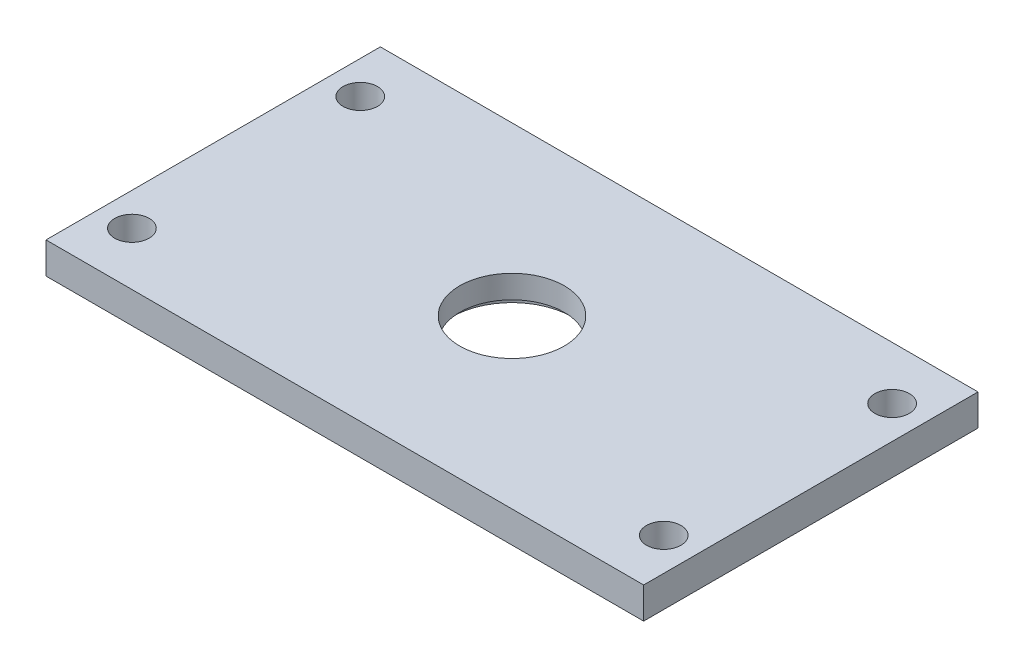
ISO-10303-21;
HEADER;
FILE_DESCRIPTION(('STEP AP214'),'2;1');
FILE_NAME('part.step','',(''),(''),'','','');
FILE_SCHEMA(('AUTOMOTIVE_DESIGN { 1 0 10303 214 1 1 1 1 }'));
ENDSEC;
DATA;
#1=APPLICATION_CONTEXT('core data for automotive mechanical design processes');
#2=APPLICATION_PROTOCOL_DEFINITION('international standard','automotive_design',2000,#1);
#3=PRODUCT_CONTEXT('',#1,'mechanical');
#4=PRODUCT('Part','Part','',(#3));
#5=PRODUCT_RELATED_PRODUCT_CATEGORY('part','',(#4));
#6=PRODUCT_DEFINITION_FORMATION('','',#4);
#7=PRODUCT_DEFINITION_CONTEXT('part definition',#1,'design');
#8=PRODUCT_DEFINITION('design','',#6,#7);
#9=PRODUCT_DEFINITION_SHAPE('','',#8);
#10=(LENGTH_UNIT() NAMED_UNIT(*) SI_UNIT(.MILLI.,.METRE.));
#11=(NAMED_UNIT(*) PLANE_ANGLE_UNIT() SI_UNIT($,.RADIAN.));
#12=(NAMED_UNIT(*) SI_UNIT($,.STERADIAN.) SOLID_ANGLE_UNIT());
#13=UNCERTAINTY_MEASURE_WITH_UNIT(LENGTH_MEASURE(1.E-05),#10,'distance_accuracy_value','');
#14=(GEOMETRIC_REPRESENTATION_CONTEXT(3) GLOBAL_UNCERTAINTY_ASSIGNED_CONTEXT((#13)) GLOBAL_UNIT_ASSIGNED_CONTEXT((#10,
#11,#12)) REPRESENTATION_CONTEXT('',''));
#15=CARTESIAN_POINT('',(0.,0.,0.));
#16=DIRECTION('',(0.,0.,1.));
#17=DIRECTION('',(1.,0.,0.));
#18=AXIS2_PLACEMENT_3D('',#15,#16,#17);
#19=CARTESIAN_POINT('',(0.,8.801,0.));
#20=DIRECTION('',(0.,-1.,0.));
#21=DIRECTION('',(0.,0.,-1.));
#22=AXIS2_PLACEMENT_3D('',#19,#20,#21);
#23=CYLINDRICAL_SURFACE('',#22,5.);
#24=CARTESIAN_POINT('',(0.,-17.2,0.));
#25=DIRECTION('',(0.,1.,0.));
#26=DIRECTION('',(0.,0.,1.));
#27=AXIS2_PLACEMENT_3D('',#24,#25,#26);
#28=CIRCLE('',#27,5.);
#29=CARTESIAN_POINT('',(0.,-17.2,5.));
#30=VERTEX_POINT('',#29);
#31=EDGE_CURVE('E271',#30,#30,#28,.F.);
#32=ORIENTED_EDGE('',*,*,#31,.F.);
#33=EDGE_LOOP('',(#32));
#34=FACE_BOUND('',#33,.T.);
#35=CARTESIAN_POINT('',(0.,-19.4,0.));
#36=DIRECTION('',(0.,-1.,0.));
#37=DIRECTION('',(0.,0.,-1.));
#38=AXIS2_PLACEMENT_3D('',#35,#36,#37);
#39=CIRCLE('',#38,5.);
#40=CARTESIAN_POINT('',(0.,-19.4,-5.));
#41=VERTEX_POINT('',#40);
#42=EDGE_CURVE('E267',#41,#41,#39,.T.);
#43=ORIENTED_EDGE('',*,*,#42,.T.);
#44=EDGE_LOOP('',(#43));
#45=FACE_BOUND('',#44,.T.);
#46=ADVANCED_FACE('F39',(#34,#45),#23,.F.);
#47=CARTESIAN_POINT('',(0.,-20.2,0.));
#48=DIRECTION('',(0.,1.,0.));
#49=DIRECTION('',(0.,0.,1.));
#50=AXIS2_PLACEMENT_3D('',#47,#48,#49);
#51=PLANE('',#50);
#52=CARTESIAN_POINT('',(0.,-20.2,0.));
#53=DIRECTION('',(0.,-1.,0.));
#54=DIRECTION('',(0.,0.,-1.));
#55=AXIS2_PLACEMENT_3D('',#52,#53,#54);
#56=CIRCLE('',#55,5.8);
#57=CARTESIAN_POINT('',(0.,-20.2,-5.8));
#58=VERTEX_POINT('',#57);
#59=EDGE_CURVE('E272',#58,#58,#56,.T.);
#60=ORIENTED_EDGE('',*,*,#59,.F.);
#61=EDGE_LOOP('',(#60));
#62=FACE_BOUND('',#61,.T.);
#63=CARTESIAN_POINT('',(-25.45,-20.2,-10.9277472107018));
#64=DIRECTION('',(0.,1.,0.));
#65=DIRECTION('',(0.,0.,1.));
#66=AXIS2_PLACEMENT_3D('',#63,#64,#65);
#67=CIRCLE('',#66,1.65);
#68=CARTESIAN_POINT('',(-25.45,-20.2,-9.27774721070175));
#69=VERTEX_POINT('',#68);
#70=EDGE_CURVE('E281',#69,#69,#67,.T.);
#71=ORIENTED_EDGE('',*,*,#70,.T.);
#72=EDGE_LOOP('',(#71));
#73=FACE_BOUND('',#72,.T.);
#74=CARTESIAN_POINT('',(25.45,-20.2,-10.9277472107018));
#75=DIRECTION('',(0.,1.,0.));
#76=DIRECTION('',(0.,0.,1.));
#77=AXIS2_PLACEMENT_3D('',#74,#75,#76);
#78=CIRCLE('',#77,1.65);
#79=CARTESIAN_POINT('',(25.45,-20.2,-9.27774721070175));
#80=VERTEX_POINT('',#79);
#81=EDGE_CURVE('E111',#80,#80,#78,.T.);
#82=ORIENTED_EDGE('',*,*,#81,.T.);
#83=EDGE_LOOP('',(#82));
#84=FACE_BOUND('',#83,.T.);
#85=DIRECTION('',(0.,0.,1.));
#86=VECTOR('',#85,1.);
#87=CARTESIAN_POINT('',(-28.6,-20.2,-16.));
#88=LINE('',#87,#86);
#89=CARTESIAN_POINT('',(-28.6,-20.2,-16.));
#90=VERTEX_POINT('',#89);
#91=CARTESIAN_POINT('',(-28.6,-20.2,16.));
#92=VERTEX_POINT('',#91);
#93=EDGE_CURVE('E101',#90,#92,#88,.T.);
#94=ORIENTED_EDGE('',*,*,#93,.F.);
#95=DIRECTION('',(1.,0.,0.));
#96=VECTOR('',#95,1.);
#97=CARTESIAN_POINT('',(-28.6,-20.2,-16.));
#98=LINE('',#97,#96);
#99=CARTESIAN_POINT('',(28.6,-20.2,-16.));
#100=VERTEX_POINT('',#99);
#101=EDGE_CURVE('E91',#90,#100,#98,.T.);
#102=ORIENTED_EDGE('',*,*,#101,.T.);
#103=DIRECTION('',(0.,0.,1.));
#104=VECTOR('',#103,1.);
#105=CARTESIAN_POINT('',(28.6,-20.2,-16.));
#106=LINE('',#105,#104);
#107=CARTESIAN_POINT('',(28.6,-20.2,16.));
#108=VERTEX_POINT('',#107);
#109=EDGE_CURVE('E85',#100,#108,#106,.T.);
#110=ORIENTED_EDGE('',*,*,#109,.T.);
#111=DIRECTION('',(1.,0.,0.));
#112=VECTOR('',#111,1.);
#113=CARTESIAN_POINT('',(-28.6,-20.2,16.));
#114=LINE('',#113,#112);
#115=EDGE_CURVE('E90',#92,#108,#114,.T.);
#116=ORIENTED_EDGE('',*,*,#115,.F.);
#117=EDGE_LOOP('',(#94,#102,#110,#116));
#118=FACE_BOUND('',#117,.T.);
#119=CARTESIAN_POINT('',(25.45,-20.2,10.9277472107018));
#120=DIRECTION('',(0.,-1.,0.));
#121=DIRECTION('',(0.,0.,-1.));
#122=AXIS2_PLACEMENT_3D('',#119,#120,#121);
#123=CIRCLE('',#122,1.65);
#124=CARTESIAN_POINT('',(25.45,-20.2,9.27774721070175));
#125=VERTEX_POINT('',#124);
#126=EDGE_CURVE('E293',#125,#125,#123,.T.);
#127=ORIENTED_EDGE('',*,*,#126,.F.);
#128=EDGE_LOOP('',(#127));
#129=FACE_BOUND('',#128,.T.);
#130=CARTESIAN_POINT('',(-25.45,-20.2,10.9277472107018));
#131=DIRECTION('',(0.,-1.,0.));
#132=DIRECTION('',(0.,0.,-1.));
#133=AXIS2_PLACEMENT_3D('',#130,#131,#132);
#134=CIRCLE('',#133,1.65);
#135=CARTESIAN_POINT('',(-25.45,-20.2,9.27774721070175));
#136=VERTEX_POINT('',#135);
#137=EDGE_CURVE('E287',#136,#136,#134,.T.);
#138=ORIENTED_EDGE('',*,*,#137,.F.);
#139=EDGE_LOOP('',(#138));
#140=FACE_BOUND('',#139,.T.);
#141=ADVANCED_FACE('F88',(#62,#73,#84,#118,#129,#140),#51,.F.);
#142=CARTESIAN_POINT('',(0.,-17.2,0.));
#143=DIRECTION('',(0.,1.,0.));
#144=DIRECTION('',(0.,0.,1.));
#145=AXIS2_PLACEMENT_3D('',#142,#143,#144);
#146=PLANE('',#145);
#147=ORIENTED_EDGE('',*,*,#31,.T.);
#148=EDGE_LOOP('',(#147));
#149=FACE_BOUND('',#148,.T.);
#150=CARTESIAN_POINT('',(-25.45,-17.2,-10.9277472107018));
#151=DIRECTION('',(0.,1.,0.));
#152=DIRECTION('',(0.,0.,1.));
#153=AXIS2_PLACEMENT_3D('',#150,#151,#152);
#154=CIRCLE('',#153,1.65);
#155=CARTESIAN_POINT('',(-25.45,-17.2,-9.27774721070175));
#156=VERTEX_POINT('',#155);
#157=EDGE_CURVE('E275',#156,#156,#154,.T.);
#158=ORIENTED_EDGE('',*,*,#157,.F.);
#159=EDGE_LOOP('',(#158));
#160=FACE_BOUND('',#159,.T.);
#161=CARTESIAN_POINT('',(25.45,-17.2,10.9277472107018));
#162=DIRECTION('',(0.,-1.,0.));
#163=DIRECTION('',(0.,0.,-1.));
#164=AXIS2_PLACEMENT_3D('',#161,#162,#163);
#165=CIRCLE('',#164,1.65);
#166=CARTESIAN_POINT('',(25.45,-17.2,9.27774721070175));
#167=VERTEX_POINT('',#166);
#168=EDGE_CURVE('E290',#167,#167,#165,.T.);
#169=ORIENTED_EDGE('',*,*,#168,.T.);
#170=EDGE_LOOP('',(#169));
#171=FACE_BOUND('',#170,.T.);
#172=CARTESIAN_POINT('',(25.45,-17.2,-10.9277472107018));
#173=DIRECTION('',(0.,1.,0.));
#174=DIRECTION('',(0.,0.,1.));
#175=AXIS2_PLACEMENT_3D('',#172,#173,#174);
#176=CIRCLE('',#175,1.65);
#177=CARTESIAN_POINT('',(25.45,-17.2,-9.27774721070175));
#178=VERTEX_POINT('',#177);
#179=EDGE_CURVE('E296',#178,#178,#176,.T.);
#180=ORIENTED_EDGE('',*,*,#179,.F.);
#181=EDGE_LOOP('',(#180));
#182=FACE_BOUND('',#181,.T.);
#183=DIRECTION('',(0.,0.,1.));
#184=VECTOR('',#183,1.);
#185=CARTESIAN_POINT('',(-28.6,-17.2,-16.));
#186=LINE('',#185,#184);
#187=CARTESIAN_POINT('',(-28.6,-17.2,-16.));
#188=VERTEX_POINT('',#187);
#189=CARTESIAN_POINT('',(-28.6,-17.2,16.));
#190=VERTEX_POINT('',#189);
#191=EDGE_CURVE('E107',#188,#190,#186,.T.);
#192=ORIENTED_EDGE('',*,*,#191,.T.);
#193=DIRECTION('',(1.,0.,0.));
#194=VECTOR('',#193,1.);
#195=CARTESIAN_POINT('',(-28.6,-17.2,16.));
#196=LINE('',#195,#194);
#197=CARTESIAN_POINT('',(28.6,-17.2,16.));
#198=VERTEX_POINT('',#197);
#199=EDGE_CURVE('E110',#190,#198,#196,.T.);
#200=ORIENTED_EDGE('',*,*,#199,.T.);
#201=DIRECTION('',(0.,0.,1.));
#202=VECTOR('',#201,1.);
#203=CARTESIAN_POINT('',(28.6,-17.2,-16.));
#204=LINE('',#203,#202);
#205=CARTESIAN_POINT('',(28.6,-17.2,-16.));
#206=VERTEX_POINT('',#205);
#207=EDGE_CURVE('E98',#206,#198,#204,.T.);
#208=ORIENTED_EDGE('',*,*,#207,.F.);
#209=DIRECTION('',(1.,0.,0.));
#210=VECTOR('',#209,1.);
#211=CARTESIAN_POINT('',(-28.6,-17.2,-16.));
#212=LINE('',#211,#210);
#213=EDGE_CURVE('E73',#188,#206,#212,.T.);
#214=ORIENTED_EDGE('',*,*,#213,.F.);
#215=EDGE_LOOP('',(#192,#200,#208,#214));
#216=FACE_BOUND('',#215,.T.);
#217=CARTESIAN_POINT('',(-25.45,-17.2,10.9277472107018));
#218=DIRECTION('',(0.,-1.,0.));
#219=DIRECTION('',(0.,0.,-1.));
#220=AXIS2_PLACEMENT_3D('',#217,#218,#219);
#221=CIRCLE('',#220,1.65);
#222=CARTESIAN_POINT('',(-25.45,-17.2,9.27774721070175));
#223=VERTEX_POINT('',#222);
#224=EDGE_CURVE('E284',#223,#223,#221,.T.);
#225=ORIENTED_EDGE('',*,*,#224,.T.);
#226=EDGE_LOOP('',(#225));
#227=FACE_BOUND('',#226,.T.);
#228=ADVANCED_FACE('F116',(#149,#160,#171,#182,#216,#227),#146,.T.);
#229=CARTESIAN_POINT('',(-28.6,-20.2,-16.));
#230=DIRECTION('',(-1.,0.,0.));
#231=DIRECTION('',(0.,0.,1.));
#232=AXIS2_PLACEMENT_3D('',#229,#230,#231);
#233=PLANE('',#232);
#234=ORIENTED_EDGE('',*,*,#191,.F.);
#235=DIRECTION('',(0.,1.,0.));
#236=VECTOR('',#235,1.);
#237=CARTESIAN_POINT('',(-28.6,-20.2,-16.));
#238=LINE('',#237,#236);
#239=EDGE_CURVE('E11',#90,#188,#238,.T.);
#240=ORIENTED_EDGE('',*,*,#239,.F.);
#241=ORIENTED_EDGE('',*,*,#93,.T.);
#242=DIRECTION('',(0.,1.,0.));
#243=VECTOR('',#242,1.);
#244=CARTESIAN_POINT('',(-28.6,-20.2,16.));
#245=LINE('',#244,#243);
#246=EDGE_CURVE('E43',#92,#190,#245,.T.);
#247=ORIENTED_EDGE('',*,*,#246,.T.);
#248=EDGE_LOOP('',(#234,#240,#241,#247));
#249=FACE_BOUND('',#248,.T.);
#250=ADVANCED_FACE('F41',(#249),#233,.T.);
#251=CARTESIAN_POINT('',(-28.6,-20.2,-16.));
#252=DIRECTION('',(0.,0.,1.));
#253=DIRECTION('',(1.,0.,0.));
#254=AXIS2_PLACEMENT_3D('',#251,#252,#253);
#255=PLANE('',#254);
#256=ORIENTED_EDGE('',*,*,#213,.T.);
#257=DIRECTION('',(0.,1.,0.));
#258=VECTOR('',#257,1.);
#259=CARTESIAN_POINT('',(28.6,-20.2,-16.));
#260=LINE('',#259,#258);
#261=EDGE_CURVE('E49',#100,#206,#260,.T.);
#262=ORIENTED_EDGE('',*,*,#261,.F.);
#263=ORIENTED_EDGE('',*,*,#101,.F.);
#264=ORIENTED_EDGE('',*,*,#239,.T.);
#265=EDGE_LOOP('',(#256,#262,#263,#264));
#266=FACE_BOUND('',#265,.T.);
#267=ADVANCED_FACE('F119',(#266),#255,.F.);
#268=CARTESIAN_POINT('',(28.6,-20.2,-16.));
#269=DIRECTION('',(-1.,0.,0.));
#270=DIRECTION('',(0.,0.,1.));
#271=AXIS2_PLACEMENT_3D('',#268,#269,#270);
#272=PLANE('',#271);
#273=ORIENTED_EDGE('',*,*,#207,.T.);
#274=DIRECTION('',(0.,1.,0.));
#275=VECTOR('',#274,1.);
#276=CARTESIAN_POINT('',(28.6,-20.2,16.));
#277=LINE('',#276,#275);
#278=EDGE_CURVE('E95',#108,#198,#277,.T.);
#279=ORIENTED_EDGE('',*,*,#278,.F.);
#280=ORIENTED_EDGE('',*,*,#109,.F.);
#281=ORIENTED_EDGE('',*,*,#261,.T.);
#282=EDGE_LOOP('',(#273,#279,#280,#281));
#283=FACE_BOUND('',#282,.T.);
#284=ADVANCED_FACE('F96',(#283),#272,.F.);
#285=CARTESIAN_POINT('',(-28.6,-20.2,16.));
#286=DIRECTION('',(0.,0.,1.));
#287=DIRECTION('',(1.,0.,0.));
#288=AXIS2_PLACEMENT_3D('',#285,#286,#287);
#289=PLANE('',#288);
#290=ORIENTED_EDGE('',*,*,#199,.F.);
#291=ORIENTED_EDGE('',*,*,#246,.F.);
#292=ORIENTED_EDGE('',*,*,#115,.T.);
#293=ORIENTED_EDGE('',*,*,#278,.T.);
#294=EDGE_LOOP('',(#290,#291,#292,#293));
#295=FACE_BOUND('',#294,.T.);
#296=ADVANCED_FACE('F100',(#295),#289,.T.);
#297=CARTESIAN_POINT('',(25.45,-20.2,-10.9277472107018));
#298=DIRECTION('',(0.,1.,0.));
#299=DIRECTION('',(0.,0.,1.));
#300=AXIS2_PLACEMENT_3D('',#297,#298,#299);
#301=CYLINDRICAL_SURFACE('',#300,1.65);
#302=ORIENTED_EDGE('',*,*,#81,.F.);
#303=EDGE_LOOP('',(#302));
#304=FACE_BOUND('',#303,.T.);
#305=ORIENTED_EDGE('',*,*,#179,.T.);
#306=EDGE_LOOP('',(#305));
#307=FACE_BOUND('',#306,.T.);
#308=ADVANCED_FACE('F152',(#304,#307),#301,.F.);
#309=CARTESIAN_POINT('',(25.45,-20.2,10.9277472107018));
#310=DIRECTION('',(0.,1.,0.));
#311=DIRECTION('',(0.,0.,1.));
#312=AXIS2_PLACEMENT_3D('',#309,#310,#311);
#313=CYLINDRICAL_SURFACE('',#312,1.65);
#314=ORIENTED_EDGE('',*,*,#126,.T.);
#315=EDGE_LOOP('',(#314));
#316=FACE_BOUND('',#315,.T.);
#317=ORIENTED_EDGE('',*,*,#168,.F.);
#318=EDGE_LOOP('',(#317));
#319=FACE_BOUND('',#318,.T.);
#320=ADVANCED_FACE('F148',(#316,#319),#313,.F.);
#321=CARTESIAN_POINT('',(-25.45,-20.2,10.9277472107018));
#322=DIRECTION('',(0.,1.,0.));
#323=DIRECTION('',(0.,0.,1.));
#324=AXIS2_PLACEMENT_3D('',#321,#322,#323);
#325=CYLINDRICAL_SURFACE('',#324,1.65);
#326=ORIENTED_EDGE('',*,*,#137,.T.);
#327=EDGE_LOOP('',(#326));
#328=FACE_BOUND('',#327,.T.);
#329=ORIENTED_EDGE('',*,*,#224,.F.);
#330=EDGE_LOOP('',(#329));
#331=FACE_BOUND('',#330,.T.);
#332=ADVANCED_FACE('F144',(#328,#331),#325,.F.);
#333=CARTESIAN_POINT('',(-25.45,-20.2,-10.9277472107018));
#334=DIRECTION('',(0.,1.,0.));
#335=DIRECTION('',(0.,0.,1.));
#336=AXIS2_PLACEMENT_3D('',#333,#334,#335);
#337=CYLINDRICAL_SURFACE('',#336,1.65);
#338=ORIENTED_EDGE('',*,*,#70,.F.);
#339=EDGE_LOOP('',(#338));
#340=FACE_BOUND('',#339,.T.);
#341=ORIENTED_EDGE('',*,*,#157,.T.);
#342=EDGE_LOOP('',(#341));
#343=FACE_BOUND('',#342,.T.);
#344=ADVANCED_FACE('F141',(#340,#343),#337,.F.);
#345=CARTESIAN_POINT('',(0.,-19.4,0.));
#346=DIRECTION('',(0.,-1.,0.));
#347=DIRECTION('',(0.,0.,-1.));
#348=AXIS2_PLACEMENT_3D('',#345,#346,#347);
#349=CYLINDRICAL_SURFACE('',#348,5.8);
#350=CARTESIAN_POINT('',(0.,-19.4,0.));
#351=DIRECTION('',(0.,-1.,0.));
#352=DIRECTION('',(0.,0.,-1.));
#353=AXIS2_PLACEMENT_3D('',#350,#351,#352);
#354=CIRCLE('',#353,5.8);
#355=CARTESIAN_POINT('',(0.,-19.4,-5.8));
#356=VERTEX_POINT('',#355);
#357=EDGE_CURVE('E270',#356,#356,#354,.T.);
#358=ORIENTED_EDGE('',*,*,#357,.F.);
#359=EDGE_LOOP('',(#358));
#360=FACE_BOUND('',#359,.T.);
#361=ORIENTED_EDGE('',*,*,#59,.T.);
#362=EDGE_LOOP('',(#361));
#363=FACE_BOUND('',#362,.T.);
#364=ADVANCED_FACE('F139',(#360,#363),#349,.F.);
#365=CARTESIAN_POINT('',(0.,-19.4,0.));
#366=DIRECTION('',(0.,-1.,0.));
#367=DIRECTION('',(0.,0.,-1.));
#368=AXIS2_PLACEMENT_3D('',#365,#366,#367);
#369=PLANE('',#368);
#370=ORIENTED_EDGE('',*,*,#42,.F.);
#371=EDGE_LOOP('',(#370));
#372=FACE_BOUND('',#371,.T.);
#373=ORIENTED_EDGE('',*,*,#357,.T.);
#374=EDGE_LOOP('',(#373));
#375=FACE_BOUND('',#374,.T.);
#376=ADVANCED_FACE('F190',(#372,#375),#369,.T.);
#377=CLOSED_SHELL('',(#46,#141,#228,#250,#267,#284,#296,#308,#320,#332,#344,#364,#376));
#378=MANIFOLD_SOLID_BREP('B2',#377);
#379=ADVANCED_BREP_SHAPE_REPRESENTATION('',(#18,#378),#14);
#380=SHAPE_DEFINITION_REPRESENTATION(#9,#379);
ENDSEC;
END-ISO-10303-21;
